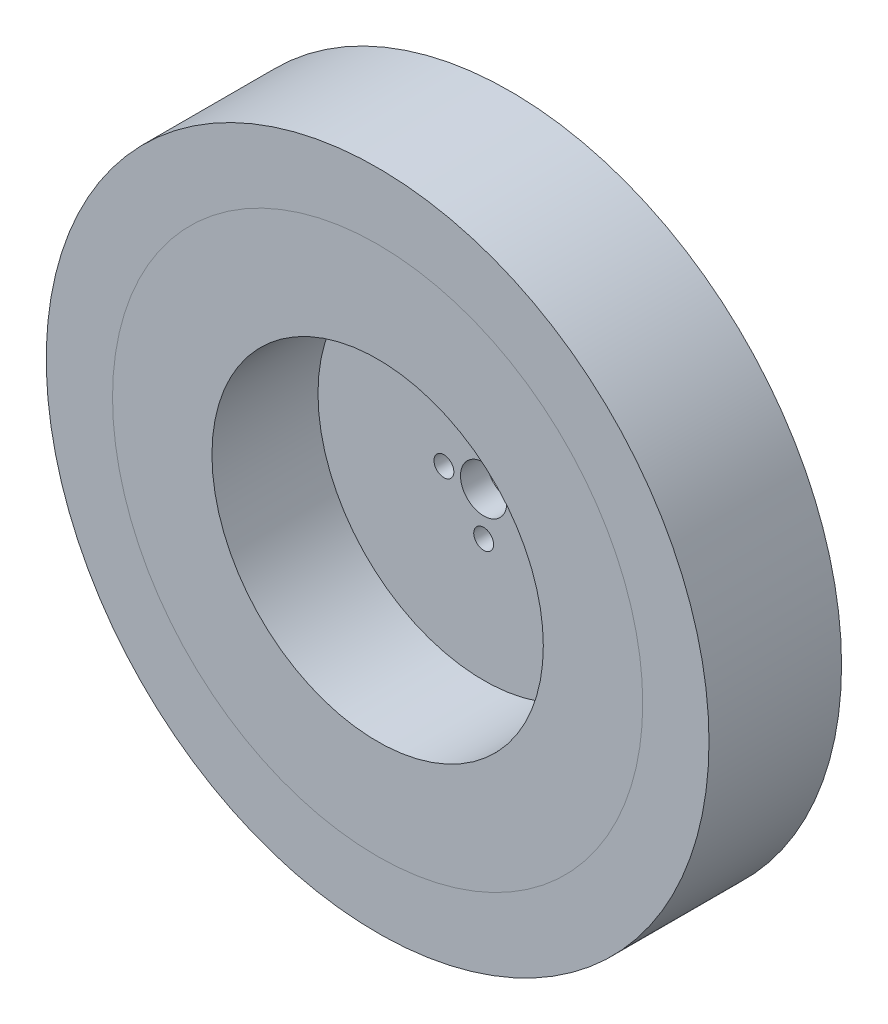
ISO-10303-21;
HEADER;
FILE_DESCRIPTION(('STEP AP214'),'2;1');
FILE_NAME('part.step','',(''),(''),'','','');
FILE_SCHEMA(('AUTOMOTIVE_DESIGN { 1 0 10303 214 1 1 1 1 }'));
ENDSEC;
DATA;
#1=APPLICATION_CONTEXT('core data for automotive mechanical design processes');
#2=APPLICATION_PROTOCOL_DEFINITION('international standard','automotive_design',2000,#1);
#3=PRODUCT_CONTEXT('',#1,'mechanical');
#4=PRODUCT('Part','Part','',(#3));
#5=PRODUCT_RELATED_PRODUCT_CATEGORY('part','',(#4));
#6=PRODUCT_DEFINITION_FORMATION('','',#4);
#7=PRODUCT_DEFINITION_CONTEXT('part definition',#1,'design');
#8=PRODUCT_DEFINITION('design','',#6,#7);
#9=PRODUCT_DEFINITION_SHAPE('','',#8);
#10=(LENGTH_UNIT() NAMED_UNIT(*) SI_UNIT(.MILLI.,.METRE.));
#11=(NAMED_UNIT(*) PLANE_ANGLE_UNIT() SI_UNIT($,.RADIAN.));
#12=(NAMED_UNIT(*) SI_UNIT($,.STERADIAN.) SOLID_ANGLE_UNIT());
#13=UNCERTAINTY_MEASURE_WITH_UNIT(LENGTH_MEASURE(1.E-05),#10,'distance_accuracy_value','');
#14=(GEOMETRIC_REPRESENTATION_CONTEXT(3) GLOBAL_UNCERTAINTY_ASSIGNED_CONTEXT((#13)) GLOBAL_UNIT_ASSIGNED_CONTEXT((#10,
#11,#12)) REPRESENTATION_CONTEXT('',''));
#15=CARTESIAN_POINT('',(0.,0.,0.));
#16=DIRECTION('',(0.,0.,1.));
#17=DIRECTION('',(1.,0.,0.));
#18=AXIS2_PLACEMENT_3D('',#15,#16,#17);
#19=CARTESIAN_POINT('',(0.,0.,-6.));
#20=DIRECTION('',(0.,0.,-1.));
#21=DIRECTION('',(-1.,0.,0.));
#22=AXIS2_PLACEMENT_3D('',#19,#20,#21);
#23=PLANE('',#22);
#24=CARTESIAN_POINT('',(0.,0.,-6.));
#25=DIRECTION('',(0.,0.,1.));
#26=DIRECTION('',(1.,0.,0.));
#27=AXIS2_PLACEMENT_3D('',#24,#25,#26);
#28=CIRCLE('',#27,3.5);
#29=CARTESIAN_POINT('',(3.5,0.,-6.));
#30=VERTEX_POINT('',#29);
#31=EDGE_CURVE('E55',#30,#30,#28,.T.);
#32=ORIENTED_EDGE('',*,*,#31,.F.);
#33=EDGE_LOOP('',(#32));
#34=FACE_BOUND('',#33,.T.);
#35=CARTESIAN_POINT('',(0.,-6.5,-6.));
#36=DIRECTION('',(0.,0.,1.));
#37=DIRECTION('',(1.,0.,0.));
#38=AXIS2_PLACEMENT_3D('',#35,#36,#37);
#39=CIRCLE('',#38,1.5);
#40=CARTESIAN_POINT('',(1.5,-6.5,-6.));
#41=VERTEX_POINT('',#40);
#42=EDGE_CURVE('E73',#41,#41,#39,.T.);
#43=ORIENTED_EDGE('',*,*,#42,.F.);
#44=EDGE_LOOP('',(#43));
#45=FACE_BOUND('',#44,.T.);
#46=CARTESIAN_POINT('',(6.,0.,-6.));
#47=DIRECTION('',(0.,0.,1.));
#48=DIRECTION('',(1.,0.,0.));
#49=AXIS2_PLACEMENT_3D('',#46,#47,#48);
#50=CIRCLE('',#49,1.5);
#51=CARTESIAN_POINT('',(7.5,0.,-6.));
#52=VERTEX_POINT('',#51);
#53=EDGE_CURVE('E80',#52,#52,#50,.T.);
#54=ORIENTED_EDGE('',*,*,#53,.F.);
#55=EDGE_LOOP('',(#54));
#56=FACE_BOUND('',#55,.T.);
#57=CARTESIAN_POINT('',(-6.,0.,-6.));
#58=DIRECTION('',(0.,0.,1.));
#59=DIRECTION('',(1.,0.,0.));
#60=AXIS2_PLACEMENT_3D('',#57,#58,#59);
#61=CIRCLE('',#60,1.5);
#62=CARTESIAN_POINT('',(-4.5,0.,-6.));
#63=VERTEX_POINT('',#62);
#64=EDGE_CURVE('E61',#63,#63,#61,.T.);
#65=ORIENTED_EDGE('',*,*,#64,.F.);
#66=EDGE_LOOP('',(#65));
#67=FACE_BOUND('',#66,.T.);
#68=CARTESIAN_POINT('',(0.,6.5,-6.));
#69=DIRECTION('',(0.,0.,1.));
#70=DIRECTION('',(1.,0.,0.));
#71=AXIS2_PLACEMENT_3D('',#68,#69,#70);
#72=CIRCLE('',#71,1.5);
#73=CARTESIAN_POINT('',(1.5,6.5,-6.));
#74=VERTEX_POINT('',#73);
#75=EDGE_CURVE('E68',#74,#74,#72,.T.);
#76=ORIENTED_EDGE('',*,*,#75,.F.);
#77=EDGE_LOOP('',(#76));
#78=FACE_BOUND('',#77,.T.);
#79=CARTESIAN_POINT('',(0.,0.,-6.));
#80=DIRECTION('',(0.,0.,1.));
#81=DIRECTION('',(1.,0.,0.));
#82=AXIS2_PLACEMENT_3D('',#79,#80,#81);
#83=CIRCLE('',#82,25.);
#84=CARTESIAN_POINT('',(25.,0.,-6.));
#85=VERTEX_POINT('',#84);
#86=EDGE_CURVE('E85',#85,#85,#83,.T.);
#87=ORIENTED_EDGE('',*,*,#86,.T.);
#88=EDGE_LOOP('',(#87));
#89=FACE_BOUND('',#88,.T.);
#90=ADVANCED_FACE('F42',(#34,#45,#56,#67,#78,#89),#23,.F.);
#91=CARTESIAN_POINT('',(0.,0.,10.));
#92=DIRECTION('',(0.,0.,1.));
#93=DIRECTION('',(1.,0.,0.));
#94=AXIS2_PLACEMENT_3D('',#91,#92,#93);
#95=PLANE('',#94);
#96=CARTESIAN_POINT('',(0.,0.,10.));
#97=DIRECTION('',(0.,0.,1.));
#98=DIRECTION('',(1.,0.,0.));
#99=AXIS2_PLACEMENT_3D('',#96,#97,#98);
#100=CIRCLE('',#99,40.);
#101=CARTESIAN_POINT('',(40.,0.,10.));
#102=VERTEX_POINT('',#101);
#103=EDGE_CURVE('E11',#102,#102,#100,.T.);
#104=ORIENTED_EDGE('',*,*,#103,.T.);
#105=EDGE_LOOP('',(#104));
#106=FACE_BOUND('',#105,.T.);
#107=CARTESIAN_POINT('',(0.,0.,10.));
#108=DIRECTION('',(0.,0.,1.));
#109=DIRECTION('',(1.,0.,0.));
#110=AXIS2_PLACEMENT_3D('',#107,#108,#109);
#111=CIRCLE('',#110,25.);
#112=CARTESIAN_POINT('',(25.,0.,10.));
#113=VERTEX_POINT('',#112);
#114=EDGE_CURVE('E77',#113,#113,#111,.T.);
#115=ORIENTED_EDGE('',*,*,#114,.F.);
#116=EDGE_LOOP('',(#115));
#117=FACE_BOUND('',#116,.T.);
#118=ADVANCED_FACE('F94',(#106,#117),#95,.T.);
#119=CARTESIAN_POINT('',(0.,0.,-10.));
#120=DIRECTION('',(0.,0.,1.));
#121=DIRECTION('',(1.,0.,0.));
#122=AXIS2_PLACEMENT_3D('',#119,#120,#121);
#123=PLANE('',#122);
#124=CARTESIAN_POINT('',(0.,6.5,-10.));
#125=DIRECTION('',(0.,0.,1.));
#126=DIRECTION('',(1.,0.,0.));
#127=AXIS2_PLACEMENT_3D('',#124,#125,#126);
#128=CIRCLE('',#127,1.5);
#129=CARTESIAN_POINT('',(1.5,6.5,-10.));
#130=VERTEX_POINT('',#129);
#131=EDGE_CURVE('E58',#130,#130,#128,.T.);
#132=ORIENTED_EDGE('',*,*,#131,.T.);
#133=EDGE_LOOP('',(#132));
#134=FACE_BOUND('',#133,.T.);
#135=CARTESIAN_POINT('',(-6.,0.,-10.));
#136=DIRECTION('',(0.,0.,1.));
#137=DIRECTION('',(1.,0.,0.));
#138=AXIS2_PLACEMENT_3D('',#135,#136,#137);
#139=CIRCLE('',#138,1.5);
#140=CARTESIAN_POINT('',(-4.5,0.,-10.));
#141=VERTEX_POINT('',#140);
#142=EDGE_CURVE('E64',#141,#141,#139,.T.);
#143=ORIENTED_EDGE('',*,*,#142,.T.);
#144=EDGE_LOOP('',(#143));
#145=FACE_BOUND('',#144,.T.);
#146=CARTESIAN_POINT('',(6.,0.,-10.));
#147=DIRECTION('',(0.,0.,1.));
#148=DIRECTION('',(1.,0.,0.));
#149=AXIS2_PLACEMENT_3D('',#146,#147,#148);
#150=CIRCLE('',#149,1.5);
#151=CARTESIAN_POINT('',(7.5,0.,-10.));
#152=VERTEX_POINT('',#151);
#153=EDGE_CURVE('E65',#152,#152,#150,.T.);
#154=ORIENTED_EDGE('',*,*,#153,.T.);
#155=EDGE_LOOP('',(#154));
#156=FACE_BOUND('',#155,.T.);
#157=CARTESIAN_POINT('',(0.,-6.5,-10.));
#158=DIRECTION('',(0.,0.,1.));
#159=DIRECTION('',(1.,0.,0.));
#160=AXIS2_PLACEMENT_3D('',#157,#158,#159);
#161=CIRCLE('',#160,1.5);
#162=CARTESIAN_POINT('',(1.5,-6.5,-10.));
#163=VERTEX_POINT('',#162);
#164=EDGE_CURVE('E76',#163,#163,#161,.T.);
#165=ORIENTED_EDGE('',*,*,#164,.T.);
#166=EDGE_LOOP('',(#165));
#167=FACE_BOUND('',#166,.T.);
#168=CARTESIAN_POINT('',(0.,0.,-10.));
#169=DIRECTION('',(0.,0.,1.));
#170=DIRECTION('',(1.,0.,0.));
#171=AXIS2_PLACEMENT_3D('',#168,#169,#170);
#172=CIRCLE('',#171,3.5);
#173=CARTESIAN_POINT('',(3.5,0.,-10.));
#174=VERTEX_POINT('',#173);
#175=EDGE_CURVE('E53',#174,#174,#172,.T.);
#176=ORIENTED_EDGE('',*,*,#175,.T.);
#177=EDGE_LOOP('',(#176));
#178=FACE_BOUND('',#177,.T.);
#179=CARTESIAN_POINT('',(0.,0.,-10.));
#180=DIRECTION('',(0.,0.,1.));
#181=DIRECTION('',(1.,0.,0.));
#182=AXIS2_PLACEMENT_3D('',#179,#180,#181);
#183=CIRCLE('',#182,40.);
#184=CARTESIAN_POINT('',(40.,0.,-10.));
#185=VERTEX_POINT('',#184);
#186=EDGE_CURVE('E46',#185,#185,#183,.T.);
#187=ORIENTED_EDGE('',*,*,#186,.F.);
#188=EDGE_LOOP('',(#187));
#189=FACE_BOUND('',#188,.T.);
#190=ADVANCED_FACE('F96',(#134,#145,#156,#167,#178,#189),#123,.F.);
#191=CARTESIAN_POINT('',(0.,0.,10.));
#192=DIRECTION('',(0.,0.,-1.));
#193=DIRECTION('',(-1.,0.,0.));
#194=AXIS2_PLACEMENT_3D('',#191,#192,#193);
#195=CYLINDRICAL_SURFACE('',#194,40.);
#196=ORIENTED_EDGE('',*,*,#103,.F.);
#197=EDGE_LOOP('',(#196));
#198=FACE_BOUND('',#197,.T.);
#199=ORIENTED_EDGE('',*,*,#186,.T.);
#200=EDGE_LOOP('',(#199));
#201=FACE_BOUND('',#200,.T.);
#202=ADVANCED_FACE('F44',(#198,#201),#195,.T.);
#203=CARTESIAN_POINT('',(0.,0.,-10.));
#204=DIRECTION('',(0.,0.,1.));
#205=DIRECTION('',(1.,0.,0.));
#206=AXIS2_PLACEMENT_3D('',#203,#204,#205);
#207=CYLINDRICAL_SURFACE('',#206,3.5);
#208=ORIENTED_EDGE('',*,*,#175,.F.);
#209=EDGE_LOOP('',(#208));
#210=FACE_BOUND('',#209,.T.);
#211=ORIENTED_EDGE('',*,*,#31,.T.);
#212=EDGE_LOOP('',(#211));
#213=FACE_BOUND('',#212,.T.);
#214=ADVANCED_FACE('F106',(#210,#213),#207,.F.);
#215=CARTESIAN_POINT('',(0.,-6.5,-10.));
#216=DIRECTION('',(0.,0.,1.));
#217=DIRECTION('',(1.,0.,0.));
#218=AXIS2_PLACEMENT_3D('',#215,#216,#217);
#219=CYLINDRICAL_SURFACE('',#218,1.5);
#220=ORIENTED_EDGE('',*,*,#164,.F.);
#221=EDGE_LOOP('',(#220));
#222=FACE_BOUND('',#221,.T.);
#223=ORIENTED_EDGE('',*,*,#42,.T.);
#224=EDGE_LOOP('',(#223));
#225=FACE_BOUND('',#224,.T.);
#226=ADVANCED_FACE('F109',(#222,#225),#219,.F.);
#227=CARTESIAN_POINT('',(6.,0.,-10.));
#228=DIRECTION('',(0.,0.,1.));
#229=DIRECTION('',(1.,0.,0.));
#230=AXIS2_PLACEMENT_3D('',#227,#228,#229);
#231=CYLINDRICAL_SURFACE('',#230,1.5);
#232=ORIENTED_EDGE('',*,*,#153,.F.);
#233=EDGE_LOOP('',(#232));
#234=FACE_BOUND('',#233,.T.);
#235=ORIENTED_EDGE('',*,*,#53,.T.);
#236=EDGE_LOOP('',(#235));
#237=FACE_BOUND('',#236,.T.);
#238=ADVANCED_FACE('F115',(#234,#237),#231,.F.);
#239=CARTESIAN_POINT('',(-6.,0.,-10.));
#240=DIRECTION('',(0.,0.,1.));
#241=DIRECTION('',(1.,0.,0.));
#242=AXIS2_PLACEMENT_3D('',#239,#240,#241);
#243=CYLINDRICAL_SURFACE('',#242,1.5);
#244=ORIENTED_EDGE('',*,*,#142,.F.);
#245=EDGE_LOOP('',(#244));
#246=FACE_BOUND('',#245,.T.);
#247=ORIENTED_EDGE('',*,*,#64,.T.);
#248=EDGE_LOOP('',(#247));
#249=FACE_BOUND('',#248,.T.);
#250=ADVANCED_FACE('F111',(#246,#249),#243,.F.);
#251=CARTESIAN_POINT('',(0.,6.5,-10.));
#252=DIRECTION('',(0.,0.,1.));
#253=DIRECTION('',(1.,0.,0.));
#254=AXIS2_PLACEMENT_3D('',#251,#252,#253);
#255=CYLINDRICAL_SURFACE('',#254,1.5);
#256=ORIENTED_EDGE('',*,*,#131,.F.);
#257=EDGE_LOOP('',(#256));
#258=FACE_BOUND('',#257,.T.);
#259=ORIENTED_EDGE('',*,*,#75,.T.);
#260=EDGE_LOOP('',(#259));
#261=FACE_BOUND('',#260,.T.);
#262=ADVANCED_FACE('F114',(#258,#261),#255,.F.);
#263=CARTESIAN_POINT('',(0.,0.,10.));
#264=DIRECTION('',(0.,0.,-1.));
#265=DIRECTION('',(-1.,0.,0.));
#266=AXIS2_PLACEMENT_3D('',#263,#264,#265);
#267=CYLINDRICAL_SURFACE('',#266,25.);
#268=ORIENTED_EDGE('',*,*,#114,.T.);
#269=EDGE_LOOP('',(#268));
#270=FACE_BOUND('',#269,.T.);
#271=ORIENTED_EDGE('',*,*,#86,.F.);
#272=EDGE_LOOP('',(#271));
#273=FACE_BOUND('',#272,.T.);
#274=ADVANCED_FACE('F91',(#270,#273),#267,.F.);
#275=CLOSED_SHELL('',(#90,#118,#190,#202,#214,#226,#238,#250,#262,#274));
#276=MANIFOLD_SOLID_BREP('B2',#275);
#277=CARTESIAN_POINT('',(0.,0.,10.));
#278=DIRECTION('',(0.,0.,1.));
#279=DIRECTION('',(1.,0.,0.));
#280=AXIS2_PLACEMENT_3D('',#277,#278,#279);
#281=PLANE('',#280);
#282=CARTESIAN_POINT('',(0.,0.,10.));
#283=DIRECTION('',(0.,0.,1.));
#284=DIRECTION('',(1.,0.,0.));
#285=AXIS2_PLACEMENT_3D('',#282,#283,#284);
#286=CIRCLE('',#285,50.);
#287=CARTESIAN_POINT('',(50.,0.,10.));
#288=VERTEX_POINT('',#287);
#289=EDGE_CURVE('E41',#288,#288,#286,.T.);
#290=ORIENTED_EDGE('',*,*,#289,.T.);
#291=EDGE_LOOP('',(#290));
#292=FACE_BOUND('',#291,.T.);
#293=CARTESIAN_POINT('',(0.,0.,10.));
#294=DIRECTION('',(0.,0.,1.));
#295=DIRECTION('',(1.,0.,0.));
#296=AXIS2_PLACEMENT_3D('',#293,#294,#295);
#297=CIRCLE('',#296,40.);
#298=CARTESIAN_POINT('',(40.,0.,10.));
#299=VERTEX_POINT('',#298);
#300=EDGE_CURVE('E234',#299,#299,#297,.T.);
#301=ORIENTED_EDGE('',*,*,#300,.F.);
#302=EDGE_LOOP('',(#301));
#303=FACE_BOUND('',#302,.T.);
#304=ADVANCED_FACE('F223',(#292,#303),#281,.T.);
#305=CARTESIAN_POINT('',(0.,0.,-10.));
#306=DIRECTION('',(0.,0.,1.));
#307=DIRECTION('',(1.,0.,0.));
#308=AXIS2_PLACEMENT_3D('',#305,#306,#307);
#309=PLANE('',#308);
#310=CARTESIAN_POINT('',(0.,0.,-10.));
#311=DIRECTION('',(0.,0.,1.));
#312=DIRECTION('',(1.,0.,0.));
#313=AXIS2_PLACEMENT_3D('',#310,#311,#312);
#314=CIRCLE('',#313,50.);
#315=CARTESIAN_POINT('',(50.,0.,-10.));
#316=VERTEX_POINT('',#315);
#317=EDGE_CURVE('E227',#316,#316,#314,.T.);
#318=ORIENTED_EDGE('',*,*,#317,.F.);
#319=EDGE_LOOP('',(#318));
#320=FACE_BOUND('',#319,.T.);
#321=CARTESIAN_POINT('',(0.,0.,-10.));
#322=DIRECTION('',(0.,0.,1.));
#323=DIRECTION('',(1.,0.,0.));
#324=AXIS2_PLACEMENT_3D('',#321,#322,#323);
#325=CIRCLE('',#324,40.);
#326=CARTESIAN_POINT('',(40.,0.,-10.));
#327=VERTEX_POINT('',#326);
#328=EDGE_CURVE('E236',#327,#327,#325,.T.);
#329=ORIENTED_EDGE('',*,*,#328,.T.);
#330=EDGE_LOOP('',(#329));
#331=FACE_BOUND('',#330,.T.);
#332=ADVANCED_FACE('F246',(#320,#331),#309,.F.);
#333=CARTESIAN_POINT('',(0.,0.,10.));
#334=DIRECTION('',(0.,0.,-1.));
#335=DIRECTION('',(-1.,0.,0.));
#336=AXIS2_PLACEMENT_3D('',#333,#334,#335);
#337=CYLINDRICAL_SURFACE('',#336,50.);
#338=ORIENTED_EDGE('',*,*,#289,.F.);
#339=EDGE_LOOP('',(#338));
#340=FACE_BOUND('',#339,.T.);
#341=ORIENTED_EDGE('',*,*,#317,.T.);
#342=EDGE_LOOP('',(#341));
#343=FACE_BOUND('',#342,.T.);
#344=ADVANCED_FACE('F225',(#340,#343),#337,.T.);
#345=CARTESIAN_POINT('',(0.,0.,10.));
#346=DIRECTION('',(0.,0.,-1.));
#347=DIRECTION('',(-1.,0.,0.));
#348=AXIS2_PLACEMENT_3D('',#345,#346,#347);
#349=CYLINDRICAL_SURFACE('',#348,40.);
#350=ORIENTED_EDGE('',*,*,#300,.T.);
#351=EDGE_LOOP('',(#350));
#352=FACE_BOUND('',#351,.T.);
#353=ORIENTED_EDGE('',*,*,#328,.F.);
#354=EDGE_LOOP('',(#353));
#355=FACE_BOUND('',#354,.T.);
#356=ADVANCED_FACE('F242',(#352,#355),#349,.F.);
#357=CLOSED_SHELL('',(#304,#332,#344,#356));
#358=MANIFOLD_SOLID_BREP('B6',#357);
#359=ADVANCED_BREP_SHAPE_REPRESENTATION('',(#18,#276,#358),#14);
#360=SHAPE_DEFINITION_REPRESENTATION(#9,#359);
ENDSEC;
END-ISO-10303-21;
